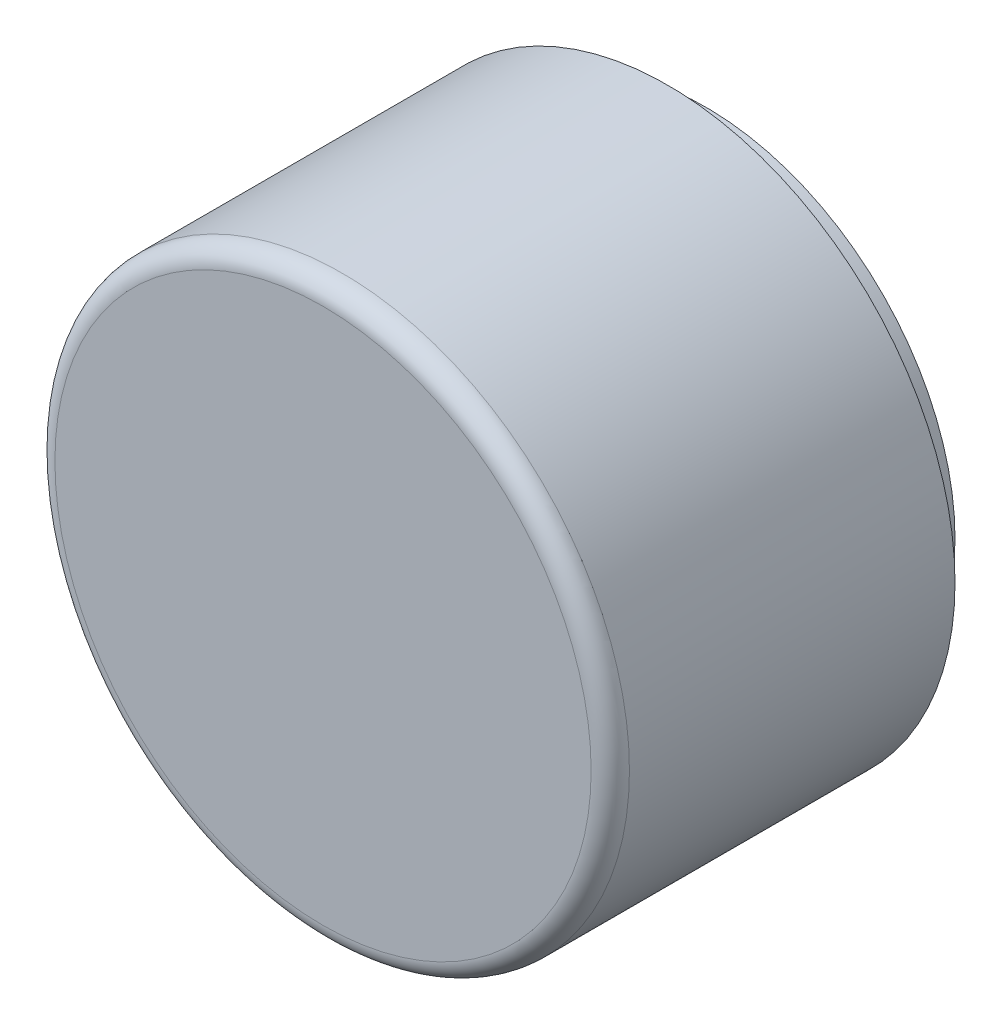
ISO-10303-21;
HEADER;
FILE_DESCRIPTION(('STEP AP214'),'2;1');
FILE_NAME('part.step','',(''),(''),'','','');
FILE_SCHEMA(('AUTOMOTIVE_DESIGN { 1 0 10303 214 1 1 1 1 }'));
ENDSEC;
DATA;
#1=APPLICATION_CONTEXT('core data for automotive mechanical design processes');
#2=APPLICATION_PROTOCOL_DEFINITION('international standard','automotive_design',2000,#1);
#3=PRODUCT_CONTEXT('',#1,'mechanical');
#4=PRODUCT('Part','Part','',(#3));
#5=PRODUCT_RELATED_PRODUCT_CATEGORY('part','',(#4));
#6=PRODUCT_DEFINITION_FORMATION('','',#4);
#7=PRODUCT_DEFINITION_CONTEXT('part definition',#1,'design');
#8=PRODUCT_DEFINITION('design','',#6,#7);
#9=PRODUCT_DEFINITION_SHAPE('','',#8);
#10=(LENGTH_UNIT() NAMED_UNIT(*) SI_UNIT(.MILLI.,.METRE.));
#11=(NAMED_UNIT(*) PLANE_ANGLE_UNIT() SI_UNIT($,.RADIAN.));
#12=(NAMED_UNIT(*) SI_UNIT($,.STERADIAN.) SOLID_ANGLE_UNIT());
#13=UNCERTAINTY_MEASURE_WITH_UNIT(LENGTH_MEASURE(1.E-05),#10,'distance_accuracy_value','');
#14=(GEOMETRIC_REPRESENTATION_CONTEXT(3) GLOBAL_UNCERTAINTY_ASSIGNED_CONTEXT((#13)) GLOBAL_UNIT_ASSIGNED_CONTEXT((#10,
#11,#12)) REPRESENTATION_CONTEXT('',''));
#15=CARTESIAN_POINT('',(0.,0.,0.));
#16=DIRECTION('',(0.,0.,1.));
#17=DIRECTION('',(1.,0.,0.));
#18=AXIS2_PLACEMENT_3D('',#15,#16,#17);
#19=CARTESIAN_POINT('',(0.,0.,-5.));
#20=DIRECTION('',(0.,0.,-1.));
#21=DIRECTION('',(-1.,0.,0.));
#22=AXIS2_PLACEMENT_3D('',#19,#20,#21);
#23=PLANE('',#22);
#24=CARTESIAN_POINT('',(0.,0.,-5.));
#25=DIRECTION('',(0.,0.,1.));
#26=DIRECTION('',(-0.877582558609531,0.479425544609743,0.));
#27=AXIS2_PLACEMENT_3D('',#24,#25,#26);
#28=CIRCLE('',#27,9.00000000000481);
#29=CARTESIAN_POINT('',(-7.89824302749,4.31482990149,-5.));
#30=VERTEX_POINT('',#29);
#31=EDGE_CURVE('E47',#30,#30,#28,.F.);
#32=ORIENTED_EDGE('',*,*,#31,.T.);
#33=EDGE_LOOP('',(#32));
#34=FACE_BOUND('',#33,.T.);
#35=ADVANCED_FACE('F15',(#34),#23,.T.);
#36=CARTESIAN_POINT('',(0.,0.,-6.));
#37=DIRECTION('',(0.,0.,1.));
#38=DIRECTION('',(-1.,0.,0.));
#39=AXIS2_PLACEMENT_3D('',#36,#37,#38);
#40=TOROIDAL_SURFACE('',#39,9.,1.);
#41=ORIENTED_EDGE('',*,*,#31,.F.);
#42=EDGE_LOOP('',(#41));
#43=FACE_BOUND('',#42,.T.);
#44=CARTESIAN_POINT('',(0.,0.,-6.));
#45=DIRECTION('',(0.,0.,-1.));
#46=DIRECTION('',(-1.,0.,0.));
#47=AXIS2_PLACEMENT_3D('',#44,#45,#46);
#48=CIRCLE('',#47,10.);
#49=CARTESIAN_POINT('',(-10.,0.,-6.));
#50=VERTEX_POINT('',#49);
#51=EDGE_CURVE('E43',#50,#50,#48,.T.);
#52=ORIENTED_EDGE('',*,*,#51,.T.);
#53=EDGE_LOOP('',(#52));
#54=FACE_BOUND('',#53,.T.);
#55=ADVANCED_FACE('F63',(#43,#54),#40,.F.);
#56=CARTESIAN_POINT('',(0.,0.,-19.9));
#57=DIRECTION('',(0.,0.,-1.));
#58=DIRECTION('',(-1.,0.,0.));
#59=AXIS2_PLACEMENT_3D('',#56,#57,#58);
#60=CYLINDRICAL_SURFACE('',#59,10.);
#61=CARTESIAN_POINT('',(0.,0.,-20.));
#62=DIRECTION('',(0.,0.,-1.));
#63=DIRECTION('',(-1.,0.,0.));
#64=AXIS2_PLACEMENT_3D('',#61,#62,#63);
#65=CIRCLE('',#64,10.);
#66=CARTESIAN_POINT('',(-10.,0.,-20.));
#67=VERTEX_POINT('',#66);
#68=EDGE_CURVE('E19',#67,#67,#65,.T.);
#69=ORIENTED_EDGE('',*,*,#68,.T.);
#70=EDGE_LOOP('',(#69));
#71=FACE_BOUND('',#70,.T.);
#72=ORIENTED_EDGE('',*,*,#51,.F.);
#73=EDGE_LOOP('',(#72));
#74=FACE_BOUND('',#73,.T.);
#75=ADVANCED_FACE('F67',(#71,#74),#60,.F.);
#76=CARTESIAN_POINT('',(0.,0.,-20.));
#77=DIRECTION('',(0.,0.,1.));
#78=DIRECTION('',(1.,0.,0.));
#79=AXIS2_PLACEMENT_3D('',#76,#77,#78);
#80=PLANE('',#79);
#81=ORIENTED_EDGE('',*,*,#68,.F.);
#82=EDGE_LOOP('',(#81));
#83=FACE_BOUND('',#82,.T.);
#84=CARTESIAN_POINT('',(0.,0.,-20.));
#85=DIRECTION('',(0.,0.,1.));
#86=DIRECTION('',(1.,0.,0.));
#87=AXIS2_PLACEMENT_3D('',#84,#85,#86);
#88=CIRCLE('',#87,13.);
#89=CARTESIAN_POINT('',(13.,0.,-20.));
#90=VERTEX_POINT('',#89);
#91=EDGE_CURVE('E37',#90,#90,#88,.T.);
#92=ORIENTED_EDGE('',*,*,#91,.F.);
#93=EDGE_LOOP('',(#92));
#94=FACE_BOUND('',#93,.T.);
#95=ADVANCED_FACE('F71',(#83,#94),#80,.F.);
#96=CARTESIAN_POINT('',(0.,0.,0.));
#97=DIRECTION('',(0.,0.,1.));
#98=DIRECTION('',(1.,0.,0.));
#99=AXIS2_PLACEMENT_3D('',#96,#97,#98);
#100=PLANE('',#99);
#101=CARTESIAN_POINT('',(0.,0.,0.));
#102=DIRECTION('',(0.,0.,-1.));
#103=DIRECTION('',(-1.,9.21714337042537E-09,0.));
#104=AXIS2_PLACEMENT_3D('',#101,#102,#103);
#105=CIRCLE('',#104,14.);
#106=CARTESIAN_POINT('',(-14.,1.29040012515026E-07,0.));
#107=VERTEX_POINT('',#106);
#108=EDGE_CURVE('E36',#107,#107,#105,.T.);
#109=ORIENTED_EDGE('',*,*,#108,.F.);
#110=EDGE_LOOP('',(#109));
#111=FACE_BOUND('',#110,.T.);
#112=ADVANCED_FACE('F74',(#111),#100,.T.);
#113=CARTESIAN_POINT('',(0.,0.,-19.));
#114=DIRECTION('',(0.,0.,1.));
#115=DIRECTION('',(1.,0.,0.));
#116=AXIS2_PLACEMENT_3D('',#113,#114,#115);
#117=CYLINDRICAL_SURFACE('',#116,13.);
#118=ORIENTED_EDGE('',*,*,#91,.T.);
#119=EDGE_LOOP('',(#118));
#120=FACE_BOUND('',#119,.T.);
#121=CARTESIAN_POINT('',(0.,0.,-18.));
#122=DIRECTION('',(0.,0.,1.));
#123=DIRECTION('',(1.,0.,0.));
#124=AXIS2_PLACEMENT_3D('',#121,#122,#123);
#125=CIRCLE('',#124,13.);
#126=CARTESIAN_POINT('',(13.,0.,-18.));
#127=VERTEX_POINT('',#126);
#128=EDGE_CURVE('E28',#127,#127,#125,.F.);
#129=ORIENTED_EDGE('',*,*,#128,.T.);
#130=EDGE_LOOP('',(#129));
#131=FACE_BOUND('',#130,.T.);
#132=ADVANCED_FACE('F79',(#120,#131),#117,.T.);
#133=CARTESIAN_POINT('',(0.,0.,-1.));
#134=DIRECTION('',(0.,0.,-1.));
#135=DIRECTION('',(1.,0.,0.));
#136=AXIS2_PLACEMENT_3D('',#133,#134,#135);
#137=TOROIDAL_SURFACE('',#136,14.,1.);
#138=ORIENTED_EDGE('',*,*,#108,.T.);
#139=EDGE_LOOP('',(#138));
#140=FACE_BOUND('',#139,.T.);
#141=CARTESIAN_POINT('',(0.,0.,-0.999999999999999));
#142=DIRECTION('',(0.,0.,1.));
#143=DIRECTION('',(1.,0.,0.));
#144=AXIS2_PLACEMENT_3D('',#141,#142,#143);
#145=CIRCLE('',#144,15.);
#146=CARTESIAN_POINT('',(15.,0.,-0.999999999999999));
#147=VERTEX_POINT('',#146);
#148=EDGE_CURVE('E23',#147,#147,#145,.F.);
#149=ORIENTED_EDGE('',*,*,#148,.F.);
#150=EDGE_LOOP('',(#149));
#151=FACE_BOUND('',#150,.T.);
#152=ADVANCED_FACE('F93',(#140,#151),#137,.T.);
#153=CARTESIAN_POINT('',(0.,0.,-18.));
#154=DIRECTION('',(0.,0.,1.));
#155=DIRECTION('',(1.,0.,0.));
#156=AXIS2_PLACEMENT_3D('',#153,#154,#155);
#157=PLANE('',#156);
#158=ORIENTED_EDGE('',*,*,#128,.F.);
#159=EDGE_LOOP('',(#158));
#160=FACE_BOUND('',#159,.T.);
#161=CARTESIAN_POINT('',(0.,0.,-18.));
#162=DIRECTION('',(0.,0.,1.));
#163=DIRECTION('',(1.,0.,0.));
#164=AXIS2_PLACEMENT_3D('',#161,#162,#163);
#165=CIRCLE('',#164,15.);
#166=CARTESIAN_POINT('',(15.,0.,-18.));
#167=VERTEX_POINT('',#166);
#168=EDGE_CURVE('E10',#167,#167,#165,.T.);
#169=ORIENTED_EDGE('',*,*,#168,.F.);
#170=EDGE_LOOP('',(#169));
#171=FACE_BOUND('',#170,.T.);
#172=ADVANCED_FACE('F96',(#160,#171),#157,.F.);
#173=CARTESIAN_POINT('',(0.,0.,-10.));
#174=DIRECTION('',(0.,0.,1.));
#175=DIRECTION('',(1.,0.,0.));
#176=AXIS2_PLACEMENT_3D('',#173,#174,#175);
#177=CYLINDRICAL_SURFACE('',#176,15.);
#178=ORIENTED_EDGE('',*,*,#168,.T.);
#179=EDGE_LOOP('',(#178));
#180=FACE_BOUND('',#179,.T.);
#181=ORIENTED_EDGE('',*,*,#148,.T.);
#182=EDGE_LOOP('',(#181));
#183=FACE_BOUND('',#182,.T.);
#184=ADVANCED_FACE('F99',(#180,#183),#177,.T.);
#185=CLOSED_SHELL('',(#35,#55,#75,#95,#112,#132,#152,#172,#184));
#186=MANIFOLD_SOLID_BREP('B1',#185);
#187=ADVANCED_BREP_SHAPE_REPRESENTATION('',(#18,#186),#14);
#188=SHAPE_DEFINITION_REPRESENTATION(#9,#187);
ENDSEC;
END-ISO-10303-21;
